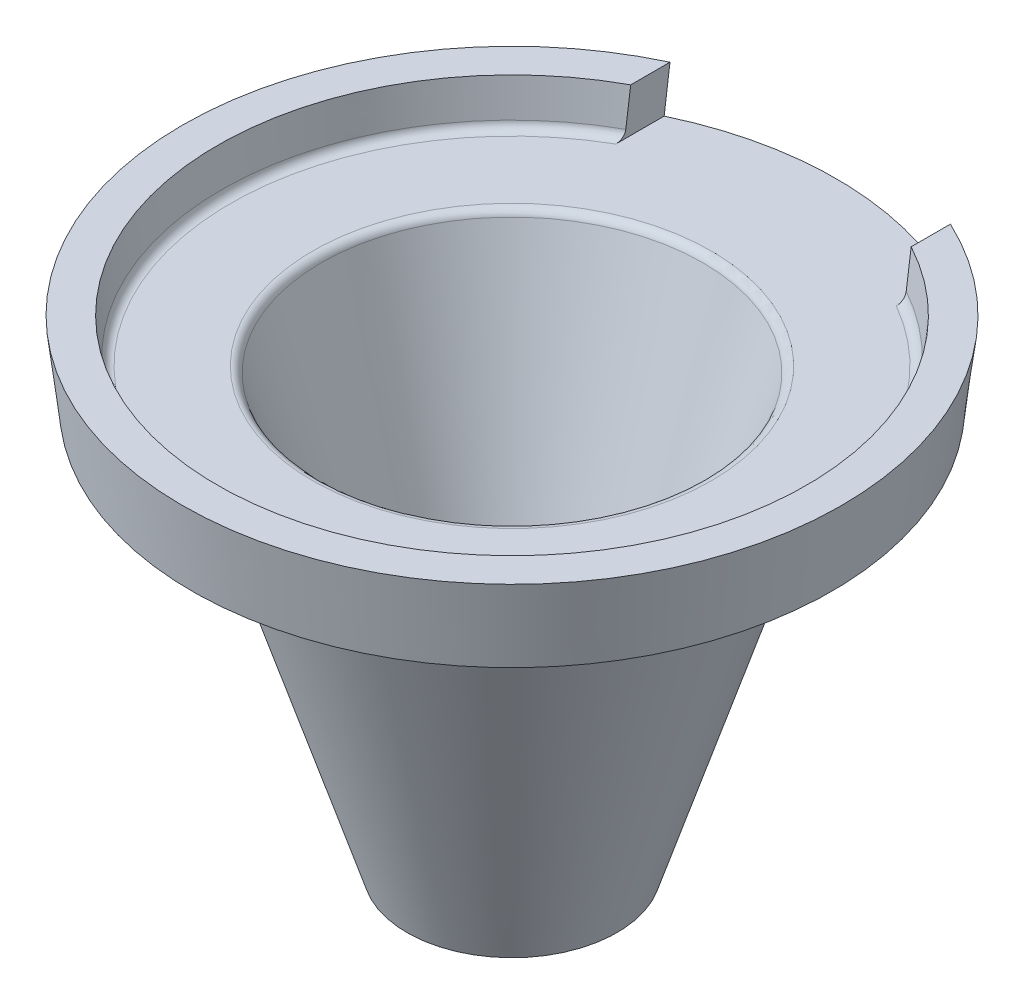
ISO-10303-21;
HEADER;
FILE_DESCRIPTION(('STEP AP214'),'2;1');
FILE_NAME('part.step','',(''),(''),'','','');
FILE_SCHEMA(('AUTOMOTIVE_DESIGN { 1 0 10303 214 1 1 1 1 }'));
ENDSEC;
DATA;
#1=APPLICATION_CONTEXT('core data for automotive mechanical design processes');
#2=APPLICATION_PROTOCOL_DEFINITION('international standard','automotive_design',2000,#1);
#3=PRODUCT_CONTEXT('',#1,'mechanical');
#4=PRODUCT('Part','Part','',(#3));
#5=PRODUCT_RELATED_PRODUCT_CATEGORY('part','',(#4));
#6=PRODUCT_DEFINITION_FORMATION('','',#4);
#7=PRODUCT_DEFINITION_CONTEXT('part definition',#1,'design');
#8=PRODUCT_DEFINITION('design','',#6,#7);
#9=PRODUCT_DEFINITION_SHAPE('','',#8);
#10=(LENGTH_UNIT() NAMED_UNIT(*) SI_UNIT(.MILLI.,.METRE.));
#11=(NAMED_UNIT(*) PLANE_ANGLE_UNIT() SI_UNIT($,.RADIAN.));
#12=(NAMED_UNIT(*) SI_UNIT($,.STERADIAN.) SOLID_ANGLE_UNIT());
#13=UNCERTAINTY_MEASURE_WITH_UNIT(LENGTH_MEASURE(1.E-05),#10,'distance_accuracy_value','');
#14=(GEOMETRIC_REPRESENTATION_CONTEXT(3) GLOBAL_UNCERTAINTY_ASSIGNED_CONTEXT((#13)) GLOBAL_UNIT_ASSIGNED_CONTEXT((#10,
#11,#12)) REPRESENTATION_CONTEXT('',''));
#15=CARTESIAN_POINT('',(0.,0.,0.));
#16=DIRECTION('',(0.,0.,1.));
#17=DIRECTION('',(1.,0.,0.));
#18=AXIS2_PLACEMENT_3D('',#15,#16,#17);
#19=CARTESIAN_POINT('',(0.,50.,0.));
#20=DIRECTION('',(0.,-1.,0.));
#21=DIRECTION('',(1.,0.,0.));
#22=AXIS2_PLACEMENT_3D('',#19,#20,#21);
#23=PLANE('',#22);
#24=CARTESIAN_POINT('',(0.,50.,0.));
#25=DIRECTION('',(0.,-1.,0.));
#26=DIRECTION('',(1.,0.,0.));
#27=AXIS2_PLACEMENT_3D('',#24,#25,#26);
#28=CIRCLE('',#27,22.7299523798725);
#29=CARTESIAN_POINT('',(22.7299523798725,50.,0.));
#30=VERTEX_POINT('',#29);
#31=EDGE_CURVE('E11',#30,#30,#28,.T.);
#32=ORIENTED_EDGE('',*,*,#31,.T.);
#33=EDGE_LOOP('',(#32));
#34=FACE_BOUND('',#33,.T.);
#35=CARTESIAN_POINT('',(0.,50.,0.));
#36=DIRECTION('',(0.,-1.,0.));
#37=DIRECTION('',(1.,0.,0.));
#38=AXIS2_PLACEMENT_3D('',#35,#36,#37);
#39=CIRCLE('',#38,32.1126208586216);
#40=CARTESIAN_POINT('',(-16.,50.,-27.8427803642089));
#41=VERTEX_POINT('',#40);
#42=CARTESIAN_POINT('',(16.,50.,-27.8427803642089));
#43=VERTEX_POINT('',#42);
#44=EDGE_CURVE('E230',#41,#43,#39,.F.);
#45=ORIENTED_EDGE('',*,*,#44,.T.);
#46=DIRECTION('',(0.,0.,1.));
#47=VECTOR('',#46,1.);
#48=CARTESIAN_POINT('',(16.,50.,-37.5988372093023));
#49=LINE('',#48,#47);
#50=CARTESIAN_POINT('',(16.,50.,-33.3616546352246));
#51=VERTEX_POINT('',#50);
#52=EDGE_CURVE('E99',#51,#43,#49,.T.);
#53=ORIENTED_EDGE('',*,*,#52,.F.);
#54=CARTESIAN_POINT('',(0.,50.,0.));
#55=DIRECTION('',(0.,-1.,0.));
#56=DIRECTION('',(1.,0.,0.));
#57=AXIS2_PLACEMENT_3D('',#54,#55,#56);
#58=CIRCLE('',#57,37.);
#59=CARTESIAN_POINT('',(-16.,50.,-33.3616546352246));
#60=VERTEX_POINT('',#59);
#61=EDGE_CURVE('E94',#51,#60,#58,.F.);
#62=ORIENTED_EDGE('',*,*,#61,.T.);
#63=DIRECTION('',(0.,0.,1.));
#64=VECTOR('',#63,1.);
#65=CARTESIAN_POINT('',(-16.,50.,-37.5988372093023));
#66=LINE('',#65,#64);
#67=EDGE_CURVE('E97',#60,#41,#66,.T.);
#68=ORIENTED_EDGE('',*,*,#67,.T.);
#69=EDGE_LOOP('',(#45,#53,#62,#68));
#70=FACE_BOUND('',#69,.T.);
#71=ADVANCED_FACE('F45',(#34,#70),#23,.F.);
#72=CARTESIAN_POINT('',(0.,50.,0.));
#73=DIRECTION('',(0.,1.,0.));
#74=DIRECTION('',(-1.,0.,0.));
#75=AXIS2_PLACEMENT_3D('',#72,#73,#74);
#76=CONICAL_SURFACE('',#75,22.,0.309702944542456);
#77=CARTESIAN_POINT('',(0.,49.3047757271038,0.));
#78=DIRECTION('',(0.,-1.,0.));
#79=DIRECTION('',(1.,0.,0.));
#80=AXIS2_PLACEMENT_3D('',#77,#78,#79);
#81=CIRCLE('',#80,21.7775282326732);
#82=CARTESIAN_POINT('',(-21.7775282326732,49.3047757271038,0.));
#83=VERTEX_POINT('',#82);
#84=EDGE_CURVE('E54',#83,#83,#81,.F.);
#85=CARTESIAN_POINT('',(0.,0.,0.));
#86=DIRECTION('',(0.,1.,0.));
#87=DIRECTION('',(-1.,0.,0.));
#88=AXIS2_PLACEMENT_3D('',#85,#86,#87);
#89=CIRCLE('',#88,5.99999999999999);
#90=CARTESIAN_POINT('',(-5.99999999999999,0.,0.));
#91=VERTEX_POINT('',#90);
#92=EDGE_CURVE('E140',#91,#91,#89,.T.);
#93=CARTESIAN_POINT('',(-21.7775282326732,49.3047757271038,0.));
#94=CARTESIAN_POINT('',(-21.6131789802495,48.7911843132798,0.));
#95=CARTESIAN_POINT('',(-21.4488297278258,48.2775928994558,0.));
#96=CARTESIAN_POINT('',(-21.1201312229785,47.2504100718078,0.));
#97=CARTESIAN_POINT('',(-20.9557819705548,46.7368186579838,0.));
#98=CARTESIAN_POINT('',(-20.6270834657075,45.7096358303358,0.));
#99=CARTESIAN_POINT('',(-20.4627342132838,45.1960444165118,0.));
#100=CARTESIAN_POINT('',(-20.1340357084364,44.1688615888638,0.));
#101=CARTESIAN_POINT('',(-19.9696864560127,43.6552701750398,0.));
#102=CARTESIAN_POINT('',(-19.6409879511654,42.6280873473918,0.));
#103=CARTESIAN_POINT('',(-19.4766386987417,42.1144959335678,0.));
#104=CARTESIAN_POINT('',(-19.1479401938943,41.0873131059198,0.));
#105=CARTESIAN_POINT('',(-18.9835909414707,40.5737216920958,0.));
#106=CARTESIAN_POINT('',(-18.6548924366233,39.5465388644478,0.));
#107=CARTESIAN_POINT('',(-18.4905431841996,39.0329474506238,0.));
#108=CARTESIAN_POINT('',(-18.1618446793523,38.0057646229758,0.));
#109=CARTESIAN_POINT('',(-17.9974954269286,37.4921732091518,0.));
#110=CARTESIAN_POINT('',(-17.6687969220812,36.4649903815038,0.));
#111=CARTESIAN_POINT('',(-17.5044476696575,35.9513989676798,0.));
#112=CARTESIAN_POINT('',(-17.1757491648102,34.9242161400318,0.));
#113=CARTESIAN_POINT('',(-17.0113999123865,34.4106247262078,0.));
#114=CARTESIAN_POINT('',(-16.6827014075391,33.3834418985599,0.));
#115=CARTESIAN_POINT('',(-16.5183521551155,32.8698504847359,0.));
#116=CARTESIAN_POINT('',(-16.1896536502681,31.8426676570879,0.));
#117=CARTESIAN_POINT('',(-16.0253043978444,31.3290762432639,0.));
#118=CARTESIAN_POINT('',(-15.6966058929971,30.3018934156159,0.));
#119=CARTESIAN_POINT('',(-15.5322566405734,29.7883020017919,0.));
#120=CARTESIAN_POINT('',(-15.203558135726,28.7611191741439,0.));
#121=CARTESIAN_POINT('',(-15.0392088833024,28.2475277603199,0.));
#122=CARTESIAN_POINT('',(-14.710510378455,27.2203449326719,0.));
#123=CARTESIAN_POINT('',(-14.5461611260313,26.7067535188479,0.));
#124=CARTESIAN_POINT('',(-14.217462621184,25.6795706911999,0.));
#125=CARTESIAN_POINT('',(-14.0531133687603,25.1659792773759,0.));
#126=CARTESIAN_POINT('',(-13.7244148639129,24.1387964497279,0.));
#127=CARTESIAN_POINT('',(-13.5600656114892,23.6252050359039,0.));
#128=CARTESIAN_POINT('',(-13.2313671066419,22.5980222082559,0.));
#129=CARTESIAN_POINT('',(-13.0670178542182,22.0844307944319,0.));
#130=CARTESIAN_POINT('',(-12.7383193493708,21.0572479667839,0.));
#131=CARTESIAN_POINT('',(-12.5739700969472,20.5436565529599,0.));
#132=CARTESIAN_POINT('',(-12.2452715920998,19.5164737253119,0.));
#133=CARTESIAN_POINT('',(-12.0809223396761,19.0028823114879,0.));
#134=CARTESIAN_POINT('',(-11.7522238348288,17.9756994838399,0.));
#135=CARTESIAN_POINT('',(-11.5878745824051,17.4621080700159,0.));
#136=CARTESIAN_POINT('',(-11.2591760775577,16.4349252423679,0.));
#137=CARTESIAN_POINT('',(-11.094826825134,15.9213338285439,0.));
#138=CARTESIAN_POINT('',(-10.7661283202867,14.8941510008959,0.));
#139=CARTESIAN_POINT('',(-10.601779067863,14.3805595870719,0.));
#140=CARTESIAN_POINT('',(-10.2730805630157,13.3533767594239,0.));
#141=CARTESIAN_POINT('',(-10.108731310592,12.8397853455999,0.));
#142=CARTESIAN_POINT('',(-9.78003280574461,11.8126025179519,0.));
#143=CARTESIAN_POINT('',(-9.61568355332094,11.299011104128,0.));
#144=CARTESIAN_POINT('',(-9.28698504847357,10.27182827648,0.));
#145=CARTESIAN_POINT('',(-9.12263579604989,9.75823686265596,0.));
#146=CARTESIAN_POINT('',(-8.79393729120253,8.73105403500796,0.));
#147=CARTESIAN_POINT('',(-8.62958803877886,8.21746262118396,0.));
#148=CARTESIAN_POINT('',(-8.3008895339315,7.19027979353597,0.));
#149=CARTESIAN_POINT('',(-8.13654028150782,6.67668837971197,0.));
#150=CARTESIAN_POINT('',(-7.80784177666046,5.64950555206398,0.));
#151=CARTESIAN_POINT('',(-7.64349252423678,5.13591413823998,0.));
#152=CARTESIAN_POINT('',(-7.31479401938942,4.10873131059198,0.));
#153=CARTESIAN_POINT('',(-7.15044476696574,3.59513989676798,0.));
#154=CARTESIAN_POINT('',(-6.82174626211838,2.56795706911998,0.));
#155=CARTESIAN_POINT('',(-6.6573970096947,2.05436565529599,0.));
#156=CARTESIAN_POINT('',(-6.32869850484734,1.02718282764799,0.));
#157=CARTESIAN_POINT('',(-6.16434925242367,0.513591413823997,0.));
#158=CARTESIAN_POINT('',(-5.99999999999999,0.,0.));
#159=B_SPLINE_CURVE_WITH_KNOTS('',3,(#93,#94,#95,#96,#97,#98,#99,#100,#101,#102,#103,#104,#105,
#106,#107,#108,#109,#110,#111,#112,#113,#114,#115,#116,#117,#118,#119,#120,#121,#122,#123,#124,
#125,#126,#127,#128,#129,#130,#131,#132,#133,#134,#135,#136,#137,#138,#139,#140,#141,#142,#143,
#144,#145,#146,#147,#148,#149,#150,#151,#152,#153,#154,#155,#156,#157,#158),.UNSPECIFIED.,.F.,
.F.,(4,2,2,2,2,2,2,2,2,2,2,2,2,2,2,2,2,2,2,2,2,2,2,2,2,2,2,2,2,2,2,2,4),(0.,1.61773958167982,
3.23547916335965,4.85321874503946,6.47095832671928,8.0886979083991,9.70643749007892,
11.3241770717587,12.9419166534386,14.5596562351184,16.1773958167982,17.795135398478,
19.4128749801578,21.0306145618377,22.6483541435175,24.2660937251973,25.8838333068771,
27.5015728885569,29.1193124702367,30.7370520519166,32.3547916335964,33.9725312152762,
35.590270796956,37.2080103786358,38.8257499603157,40.4434895419955,42.0612291236753,
43.6789687053551,45.2967082870349,46.9144478687148,48.5321874503946,50.1499270320744,
51.7676666137542),.UNSPECIFIED.);
#160=EDGE_CURVE('BSEAM214',#83,#91,#159,.T.);
#161=ORIENTED_EDGE('',*,*,#84,.T.);
#162=ORIENTED_EDGE('',*,*,#92,.F.);
#163=ORIENTED_EDGE('',*,*,#160,.T.);
#164=ORIENTED_EDGE('',*,*,#160,.F.);
#165=EDGE_LOOP('',(#161,#163,#162,#164));
#166=FACE_BOUND('',#165,.T.);
#167=ADVANCED_FACE('F214',(#166),#76,.F.);
#168=CARTESIAN_POINT('',(0.,50.,0.));
#169=DIRECTION('',(0.,1.,0.));
#170=DIRECTION('',(-1.,0.,0.));
#171=AXIS2_PLACEMENT_3D('',#168,#169,#170);
#172=CONICAL_SURFACE('',#171,37.,0.119199662874111);
#173=CARTESIAN_POINT('',(-16.,12.0699626751232,-28.2395272681148));
#174=CARTESIAN_POINT('',(-16.,14.4647163582311,-28.5691723231325));
#175=CARTESIAN_POINT('',(-16.,16.8596576558075,-28.8974516177045));
#176=CARTESIAN_POINT('',(-16.,21.6498795493539,-29.551521626845));
#177=CARTESIAN_POINT('',(-16.,24.0451601452483,-29.8773123419663));
#178=CARTESIAN_POINT('',(-16.,31.2314537126452,-30.8513155882227));
#179=CARTESIAN_POINT('',(-16.,36.0229233308828,-31.4961598892027));
#180=CARTESIAN_POINT('',(-16.,45.6068365220377,-32.7783879690962));
#181=CARTESIAN_POINT('',(-16.,50.399280090238,-33.4157717833058));
#182=CARTESIAN_POINT('',(-16.,59.9849990169389,-34.6842588380499));
#183=CARTESIAN_POINT('',(-16.,64.7782743756083,-35.3153620773074));
#184=CARTESIAN_POINT('',(-16.,73.4644935278817,-36.4541034563798));
#185=CARTESIAN_POINT('',(-16.,77.3573181399374,-36.9626513616146));
#186=CARTESIAN_POINT('',(-16.,85.1433821313285,-37.9766220105313));
#187=CARTESIAN_POINT('',(-16.,89.0366215114586,-38.4820447481119));
#188=CARTESIAN_POINT('',(-16.,92.9300373248768,-38.9861026442004));
#189=B_SPLINE_CURVE_WITH_KNOTS('',3,(#173,#174,#175,#176,#177,#178,#179,#180,#181,#182,#183,
#184,#185,#186,#187,#188),.UNSPECIFIED.,.F.,.F.,(4,2,2,2,2,2,2,4),(0.,7.25200558737984,
14.5040095635583,29.0080027776038,43.511927344286,58.0158548598878,69.7935588222939,
81.5712857712329),.UNSPECIFIED.);
#190=CARTESIAN_POINT('',(-16.,55.,-34.0245875726895));
#191=VERTEX_POINT('',#190);
#192=EDGE_CURVE('E109',#60,#191,#189,.T.);
#193=ORIENTED_EDGE('',*,*,#192,.F.);
#194=ORIENTED_EDGE('',*,*,#61,.F.);
#195=CARTESIAN_POINT('',(16.,92.9300373248768,-38.9861026442004));
#196=CARTESIAN_POINT('',(16.,89.5593596553212,-38.5497268108781));
#197=CARTESIAN_POINT('',(16.,86.1888156130985,-38.1123198420995));
#198=CARTESIAN_POINT('',(16.,79.4480269867124,-37.2352015582156));
#199=CARTESIAN_POINT('',(16.,76.077782402585,-36.795490242832));
#200=CARTESIAN_POINT('',(16.,65.9675742044657,-35.4725403341985));
#201=CARTESIAN_POINT('',(16.,59.2281092984913,-34.5854823068104));
#202=CARTESIAN_POINT('',(16.,49.1201790188609,-33.2453001659488));
#203=CARTESIAN_POINT('',(16.,45.7510772947519,-32.7969732242594));
#204=CARTESIAN_POINT('',(16.,39.0133587008946,-31.8966925378096));
#205=CARTESIAN_POINT('',(16.,35.6447418310802,-31.4447387935446));
#206=CARTESIAN_POINT('',(16.,28.9080488695205,-30.5367198106923));
#207=CARTESIAN_POINT('',(16.,25.5399727798847,-30.0806545564447));
#208=CARTESIAN_POINT('',(16.,18.804462945049,-29.1637937002521));
#209=CARTESIAN_POINT('',(16.,15.4370292001711,-28.7029980959422));
#210=CARTESIAN_POINT('',(16.,12.0699626751232,-28.2395272681148));
#211=B_SPLINE_CURVE_WITH_KNOTS('',3,(#195,#196,#197,#198,#199,#200,#201,#202,#203,#204,#205,
#206,#207,#208,#209,#210),.UNSPECIFIED.,.F.,.F.,(4,2,2,2,2,2,2,4),(0.,10.1964217169354,
20.3928446651734,40.7856093523593,50.9820087125508,61.1784066799983,71.3748435010719,
81.5712854198876),.UNSPECIFIED.);
#212=CARTESIAN_POINT('',(16.,55.,-34.0245875726895));
#213=VERTEX_POINT('',#212);
#214=EDGE_CURVE('E104',#213,#51,#211,.T.);
#215=ORIENTED_EDGE('',*,*,#214,.F.);
#216=CARTESIAN_POINT('',(0.,55.,0.));
#217=DIRECTION('',(0.,1.,0.));
#218=DIRECTION('',(-1.,0.,0.));
#219=AXIS2_PLACEMENT_3D('',#216,#217,#218);
#220=CIRCLE('',#219,37.5988372093023);
#221=EDGE_CURVE('E120',#191,#213,#220,.T.);
#222=ORIENTED_EDGE('',*,*,#221,.F.);
#223=EDGE_LOOP('',(#193,#194,#215,#222));
#224=FACE_BOUND('',#223,.T.);
#225=CARTESIAN_POINT('',(0.,46.,0.));
#226=DIRECTION('',(0.,1.,0.));
#227=DIRECTION('',(-1.,0.,0.));
#228=AXIS2_PLACEMENT_3D('',#225,#226,#227);
#229=CIRCLE('',#228,36.5209302325581);
#230=CARTESIAN_POINT('',(-36.5209302325581,46.,0.));
#231=VERTEX_POINT('',#230);
#232=EDGE_CURVE('E194',#231,#231,#229,.T.);
#233=ORIENTED_EDGE('',*,*,#232,.T.);
#234=EDGE_LOOP('',(#233));
#235=FACE_BOUND('',#234,.T.);
#236=ADVANCED_FACE('F117',(#224,#235),#172,.T.);
#237=CARTESIAN_POINT('',(0.,46.,0.));
#238=DIRECTION('',(0.,-1.,0.));
#239=DIRECTION('',(1.,0.,0.));
#240=AXIS2_PLACEMENT_3D('',#237,#238,#239);
#241=PLANE('',#240);
#242=CARTESIAN_POINT('',(0.,46.,0.));
#243=DIRECTION('',(0.,1.,0.));
#244=DIRECTION('',(-1.,0.,0.));
#245=AXIS2_PLACEMENT_3D('',#242,#243,#244);
#246=CIRCLE('',#245,26.72);
#247=CARTESIAN_POINT('',(-26.72,46.,0.));
#248=VERTEX_POINT('',#247);
#249=EDGE_CURVE('E201',#248,#248,#246,.T.);
#250=ORIENTED_EDGE('',*,*,#249,.T.);
#251=EDGE_LOOP('',(#250));
#252=FACE_BOUND('',#251,.T.);
#253=ORIENTED_EDGE('',*,*,#232,.F.);
#254=EDGE_LOOP('',(#253));
#255=FACE_BOUND('',#254,.T.);
#256=ADVANCED_FACE('F221',(#252,#255),#241,.T.);
#257=CARTESIAN_POINT('',(0.,0.,0.));
#258=DIRECTION('',(0.,1.,0.));
#259=DIRECTION('',(-1.,0.,0.));
#260=AXIS2_PLACEMENT_3D('',#257,#258,#259);
#261=CONICAL_SURFACE('',#260,12.,0.309702944542456);
#262=ORIENTED_EDGE('',*,*,#249,.F.);
#263=EDGE_LOOP('',(#262));
#264=FACE_BOUND('',#263,.T.);
#265=CARTESIAN_POINT('',(0.,0.,0.));
#266=DIRECTION('',(0.,1.,0.));
#267=DIRECTION('',(-1.,0.,0.));
#268=AXIS2_PLACEMENT_3D('',#265,#266,#267);
#269=CIRCLE('',#268,12.);
#270=CARTESIAN_POINT('',(-12.,0.,0.));
#271=VERTEX_POINT('',#270);
#272=EDGE_CURVE('E204',#271,#271,#269,.T.);
#273=ORIENTED_EDGE('',*,*,#272,.T.);
#274=EDGE_LOOP('',(#273));
#275=FACE_BOUND('',#274,.T.);
#276=ADVANCED_FACE('F321',(#264,#275),#261,.T.);
#277=CARTESIAN_POINT('',(0.,0.,0.));
#278=DIRECTION('',(0.,1.,0.));
#279=DIRECTION('',(-1.,0.,0.));
#280=AXIS2_PLACEMENT_3D('',#277,#278,#279);
#281=PLANE('',#280);
#282=ORIENTED_EDGE('',*,*,#272,.F.);
#283=EDGE_LOOP('',(#282));
#284=FACE_BOUND('',#283,.T.);
#285=ORIENTED_EDGE('',*,*,#92,.T.);
#286=EDGE_LOOP('',(#285));
#287=FACE_BOUND('',#286,.T.);
#288=ADVANCED_FACE('F150',(#284,#287),#281,.F.);
#289=CARTESIAN_POINT('',(-33.5988372093023,55.,0.));
#290=DIRECTION('',(0.,1.,0.));
#291=DIRECTION('',(-1.,0.,0.));
#292=AXIS2_PLACEMENT_3D('',#289,#290,#291);
#293=PLANE('',#292);
#294=DIRECTION('',(0.,0.,1.));
#295=VECTOR('',#294,1.);
#296=CARTESIAN_POINT('',(-16.,55.,-37.5988372093023));
#297=LINE('',#296,#295);
#298=CARTESIAN_POINT('',(-16.,55.,-29.5445741519014));
#299=VERTEX_POINT('',#298);
#300=EDGE_CURVE('E105',#191,#299,#297,.T.);
#301=ORIENTED_EDGE('',*,*,#300,.F.);
#302=ORIENTED_EDGE('',*,*,#221,.T.);
#303=DIRECTION('',(0.,0.,1.));
#304=VECTOR('',#303,1.);
#305=CARTESIAN_POINT('',(16.,55.,-37.5988372093023));
#306=LINE('',#305,#304);
#307=CARTESIAN_POINT('',(16.,55.,-29.5445741519014));
#308=VERTEX_POINT('',#307);
#309=EDGE_CURVE('E235',#213,#308,#306,.T.);
#310=ORIENTED_EDGE('',*,*,#309,.T.);
#311=CARTESIAN_POINT('',(0.,55.,0.));
#312=DIRECTION('',(0.,1.,0.));
#313=DIRECTION('',(-1.,0.,0.));
#314=AXIS2_PLACEMENT_3D('',#311,#312,#313);
#315=CIRCLE('',#314,33.5988372093023);
#316=EDGE_CURVE('E125',#299,#308,#315,.T.);
#317=ORIENTED_EDGE('',*,*,#316,.F.);
#318=EDGE_LOOP('',(#301,#302,#310,#317));
#319=FACE_BOUND('',#318,.T.);
#320=ADVANCED_FACE('F184',(#319),#293,.T.);
#321=CARTESIAN_POINT('',(0.,50.,0.));
#322=DIRECTION('',(0.,1.,0.));
#323=DIRECTION('',(-1.,0.,0.));
#324=AXIS2_PLACEMENT_3D('',#321,#322,#323);
#325=CONICAL_SURFACE('',#324,33.,0.119199662874113);
#326=CARTESIAN_POINT('',(16.,16.0309633726264,-24.1047374707818));
#327=CARTESIAN_POINT('',(16.,18.1638214574823,-24.411328730961));
#328=CARTESIAN_POINT('',(16.,20.2969284319872,-24.7161834898245));
#329=CARTESIAN_POINT('',(16.,24.5635881712652,-25.3227506369469));
#330=CARTESIAN_POINT('',(16.,26.6971409358277,-25.6244630266871));
#331=CARTESIAN_POINT('',(16.,33.0983840254043,-26.5253817649382));
#332=CARTESIAN_POINT('',(16.,37.3666680653553,-27.1203709617351));
#333=CARTESIAN_POINT('',(16.,45.9044700816108,-28.3011291093392));
#334=CARTESIAN_POINT('',(16.,50.1739880464471,-28.8868981431995));
#335=CARTESIAN_POINT('',(16.,58.7140718694334,-30.0507569425638));
#336=CARTESIAN_POINT('',(16.,62.9846377280453,-30.6288467046767));
#337=CARTESIAN_POINT('',(16.,70.8739605100058,-31.6907065483635));
#338=CARTESIAN_POINT('',(16.,74.4925945938254,-32.1753901740043));
#339=CARTESIAN_POINT('',(16.,81.7304207723285,-33.1406812362934));
#340=CARTESIAN_POINT('',(16.,85.3496128691197,-33.6212886571412));
#341=CARTESIAN_POINT('',(16.,88.9690366273736,-34.1001407663813));
#342=B_SPLINE_CURVE_WITH_KNOTS('',3,(#326,#327,#328,#329,#330,#331,#332,#333,#334,#335,#336,
#337,#338,#339,#340,#341),.UNSPECIFIED.,.F.,.F.,(4,2,2,2,2,2,2,4),(0.,6.4643416046846,
12.9286801621214,25.8573302461224,38.7858638049315,51.7144030725918,62.6672486892859,
73.6201367431421),.UNSPECIFIED.);
#343=CARTESIAN_POINT('',(16.,50.8810824125766,-28.9823357347176));
#344=VERTEX_POINT('',#343);
#345=EDGE_CURVE('E187',#344,#308,#342,.T.);
#346=ORIENTED_EDGE('',*,*,#345,.F.);
#347=CARTESIAN_POINT('',(0.,50.8810824125767,0.));
#348=DIRECTION('',(0.,-1.,0.));
#349=DIRECTION('',(1.,0.,0.));
#350=AXIS2_PLACEMENT_3D('',#347,#348,#349);
#351=CIRCLE('',#350,33.1055249866226);
#352=CARTESIAN_POINT('',(-16.,50.8810824125766,-28.9823357347176));
#353=VERTEX_POINT('',#352);
#354=EDGE_CURVE('E68',#344,#353,#351,.T.);
#355=ORIENTED_EDGE('',*,*,#354,.T.);
#356=CARTESIAN_POINT('',(-16.,88.9690366273736,-34.1001407663813));
#357=CARTESIAN_POINT('',(-16.,85.9280217586833,-33.697822735884));
#358=CARTESIAN_POINT('',(-16.,82.8871727957809,-33.2942524020907));
#359=CARTESIAN_POINT('',(-16.,76.8058494242155,-32.484294614767));
#360=CARTESIAN_POINT('',(-16.,73.7653750156375,-32.0779071605988));
#361=CARTESIAN_POINT('',(-16.,64.6446265710919,-30.8540568973858));
#362=CARTESIAN_POINT('',(-16.,58.5649805334717,-30.0319000081785));
#363=CARTESIAN_POINT('',(-16.,49.4471368974871,-28.7866941242558));
#364=CARTESIAN_POINT('',(-16.,46.4081215307975,-28.3696297002888));
#365=CARTESIAN_POINT('',(-16.,40.3307216929046,-27.5309330582728));
#366=CARTESIAN_POINT('',(-16.,37.2923372215143,-27.1093008415804));
#367=CARTESIAN_POINT('',(-16.,31.2162750562776,-26.260807097018));
#368=CARTESIAN_POINT('',(-16.,28.178597367802,-25.8339455306525));
#369=CARTESIAN_POINT('',(-16.,22.1041015083756,-24.9741285560196));
#370=CARTESIAN_POINT('',(-16.,19.0672833383533,-24.5411731411946));
#371=CARTESIAN_POINT('',(-16.,16.0309633726264,-24.1047374707818));
#372=B_SPLINE_CURVE_WITH_KNOTS('',3,(#356,#357,#358,#359,#360,#361,#362,#363,#364,#365,#366,
#367,#368,#369,#370,#371),.UNSPECIFIED.,.F.,.F.,(4,2,2,2,2,2,2,4),(0.,9.20253578854335,
18.4050736609013,36.810007838248,46.0125055682302,55.215000565426,64.41756334683,
73.620136031687),.UNSPECIFIED.);
#373=EDGE_CURVE('E156',#299,#353,#372,.T.);
#374=ORIENTED_EDGE('',*,*,#373,.F.);
#375=ORIENTED_EDGE('',*,*,#316,.T.);
#376=EDGE_LOOP('',(#346,#355,#374,#375));
#377=FACE_BOUND('',#376,.T.);
#378=ADVANCED_FACE('F149',(#377),#325,.F.);
#379=CARTESIAN_POINT('',(-16.,55.,-37.5988372093023));
#380=DIRECTION('',(-1.,0.,0.));
#381=DIRECTION('',(0.,0.,1.));
#382=AXIS2_PLACEMENT_3D('',#379,#380,#381);
#383=PLANE('',#382);
#384=ORIENTED_EDGE('',*,*,#192,.T.);
#385=ORIENTED_EDGE('',*,*,#300,.T.);
#386=ORIENTED_EDGE('',*,*,#373,.T.);
#387=CARTESIAN_POINT('',(-16.,50.8810824125766,-28.9823357347176));
#388=CARTESIAN_POINT('',(-16.,50.8549797538707,-28.9787664076099));
#389=CARTESIAN_POINT('',(-16.,50.8290529862548,-28.9740242349468));
#390=CARTESIAN_POINT('',(-16.,50.7777319696878,-28.9622674896739));
#391=CARTESIAN_POINT('',(-16.,50.7523374813965,-28.9552539627798));
#392=CARTESIAN_POINT('',(-16.,50.6774596372828,-28.9309977796888));
#393=CARTESIAN_POINT('',(-16.,50.6289947651088,-28.9104990792424));
#394=CARTESIAN_POINT('',(-16.,50.5362499387301,-28.8618063634703));
#395=CARTESIAN_POINT('',(-16.,50.4919641132311,-28.8336233674736));
#396=CARTESIAN_POINT('',(-16.,50.408331806681,-28.7706469551525));
#397=CARTESIAN_POINT('',(-16.,50.3689901933697,-28.7358471077039));
#398=CARTESIAN_POINT('',(-16.,50.2934865495042,-28.6583434218672));
#399=CARTESIAN_POINT('',(-16.,50.2577059218005,-28.6152694377304));
#400=CARTESIAN_POINT('',(-16.,50.192920058599,-28.5243063643639));
#401=CARTESIAN_POINT('',(-16.,50.1639176785935,-28.4764152579193));
#402=CARTESIAN_POINT('',(-16.,50.1096536217322,-28.370722210453));
#403=CARTESIAN_POINT('',(-16.,50.085338848449,-28.3124348573589));
#404=CARTESIAN_POINT('',(-16.,50.0457067716403,-28.1928864661322));
#405=CARTESIAN_POINT('',(-16.,50.0303898239247,-28.1316253105071));
#406=CARTESIAN_POINT('',(-16.,50.0130316974325,-28.0321366974928));
#407=CARTESIAN_POINT('',(-16.,50.0081358471526,-27.9943815839291));
#408=CARTESIAN_POINT('',(-16.,50.0016248871786,-27.918680732665));
#409=CARTESIAN_POINT('',(-16.,50.0000018953716,-27.8807356741077));
#410=CARTESIAN_POINT('',(-16.,49.9999999999998,-27.8427803642089));
#411=B_SPLINE_CURVE_WITH_KNOTS('',3,(#387,#388,#389,#390,#391,#392,#393,#394,#395,#396,#397,
#398,#399,#400,#401,#402,#403,#404,#405,#406,#407,#408,#409,#410),.UNSPECIFIED.,.F.,.F.,(4,2,2,
2,2,2,2,2,2,2,2,4),(0.,0.0789812227267447,0.157926134622045,0.314958106609992,0.471766067441757,
0.628727221164487,0.796051153649451,0.96344544862855,1.15215987067364,1.3408817547409,
1.45496646307417,1.56877608842456),.UNSPECIFIED.);
#412=EDGE_CURVE('E112',#353,#41,#411,.T.);
#413=ORIENTED_EDGE('',*,*,#412,.T.);
#414=ORIENTED_EDGE('',*,*,#67,.F.);
#415=EDGE_LOOP('',(#384,#385,#386,#413,#414));
#416=FACE_BOUND('',#415,.T.);
#417=ADVANCED_FACE('F108',(#416),#383,.F.);
#418=CARTESIAN_POINT('',(16.,55.,-37.5988372093023));
#419=DIRECTION('',(1.,0.,0.));
#420=DIRECTION('',(0.,0.,-1.));
#421=AXIS2_PLACEMENT_3D('',#418,#419,#420);
#422=PLANE('',#421);
#423=ORIENTED_EDGE('',*,*,#214,.T.);
#424=ORIENTED_EDGE('',*,*,#52,.T.);
#425=CARTESIAN_POINT('',(16.,50.,-27.8427803642089));
#426=CARTESIAN_POINT('',(16.,49.9999582841518,-27.9279519893694));
#427=CARTESIAN_POINT('',(16.,50.0081836965868,-28.0132916867691));
#428=CARTESIAN_POINT('',(16.,50.0412113579546,-28.1811868268842));
#429=CARTESIAN_POINT('',(16.,50.0661079936213,-28.2637235888122));
#430=CARTESIAN_POINT('',(16.,50.1275951063801,-28.4101108288876));
#431=CARTESIAN_POINT('',(16.,50.1619033090801,-28.4749171003558));
#432=CARTESIAN_POINT('',(16.,50.2421785920542,-28.5967215152605));
#433=CARTESIAN_POINT('',(16.,50.2881136508475,-28.6537404522774));
#434=CARTESIAN_POINT('',(16.,50.3849239842895,-28.7512674307247));
#435=CARTESIAN_POINT('',(16.,50.434650056228,-28.7929141670402));
#436=CARTESIAN_POINT('',(16.,50.5413077860048,-28.8655975927916));
#437=CARTESIAN_POINT('',(16.,50.5982246863311,-28.8966555436368));
#438=CARTESIAN_POINT('',(16.,50.6934228031198,-28.9362986261118));
#439=CARTESIAN_POINT('',(16.,50.7300690508837,-28.9489051431693));
#440=CARTESIAN_POINT('',(16.,50.8047062500311,-28.969306959578));
#441=CARTESIAN_POINT('',(16.,50.8426982661483,-28.9770983551984));
#442=CARTESIAN_POINT('',(16.,50.8810824125766,-28.9823357347176));
#443=B_SPLINE_CURVE_WITH_KNOTS('',3,(#425,#426,#427,#428,#429,#430,#431,#432,#433,#434,#435,
#436,#437,#438,#439,#440,#441,#442),.UNSPECIFIED.,.F.,.F.,(4,2,2,2,2,2,2,2,4),(0.,
0.255412228017164,0.512282878135943,0.731052492100536,0.94922602757587,1.14268316022643,
1.33574952707094,1.451714856596,1.56777407899616),.UNSPECIFIED.);
#444=EDGE_CURVE('E61',#43,#344,#443,.T.);
#445=ORIENTED_EDGE('',*,*,#444,.T.);
#446=ORIENTED_EDGE('',*,*,#345,.T.);
#447=ORIENTED_EDGE('',*,*,#309,.F.);
#448=EDGE_LOOP('',(#423,#424,#445,#446,#447));
#449=FACE_BOUND('',#448,.T.);
#450=ADVANCED_FACE('F148',(#449),#422,.F.);
#451=CARTESIAN_POINT('',(0.,51.,0.));
#452=DIRECTION('',(0.,-1.,0.));
#453=DIRECTION('',(1.,0.,0.));
#454=AXIS2_PLACEMENT_3D('',#451,#452,#453);
#455=TOROIDAL_SURFACE('',#454,32.1126208586216,1.);
#456=ORIENTED_EDGE('',*,*,#412,.F.);
#457=ORIENTED_EDGE('',*,*,#354,.F.);
#458=ORIENTED_EDGE('',*,*,#444,.F.);
#459=ORIENTED_EDGE('',*,*,#44,.F.);
#460=EDGE_LOOP('',(#456,#457,#458,#459));
#461=FACE_BOUND('',#460,.T.);
#462=ADVANCED_FACE('F176',(#461),#455,.F.);
#463=CARTESIAN_POINT('',(0.,49.,0.));
#464=DIRECTION('',(0.,-1.,0.));
#465=DIRECTION('',(1.,0.,0.));
#466=AXIS2_PLACEMENT_3D('',#463,#464,#465);
#467=TOROIDAL_SURFACE('',#466,22.7299523798725,1.);
#468=ORIENTED_EDGE('',*,*,#31,.F.);
#469=EDGE_LOOP('',(#468));
#470=FACE_BOUND('',#469,.T.);
#471=ORIENTED_EDGE('',*,*,#84,.F.);
#472=EDGE_LOOP('',(#471));
#473=FACE_BOUND('',#472,.T.);
#474=ADVANCED_FACE('F47',(#470,#473),#467,.T.);
#475=CLOSED_SHELL('',(#71,#167,#236,#256,#276,#288,#320,#378,#417,#450,#462,#474));
#476=MANIFOLD_SOLID_BREP('B2',#475);
#477=ADVANCED_BREP_SHAPE_REPRESENTATION('',(#18,#476),#14);
#478=SHAPE_DEFINITION_REPRESENTATION(#9,#477);
ENDSEC;
END-ISO-10303-21;
